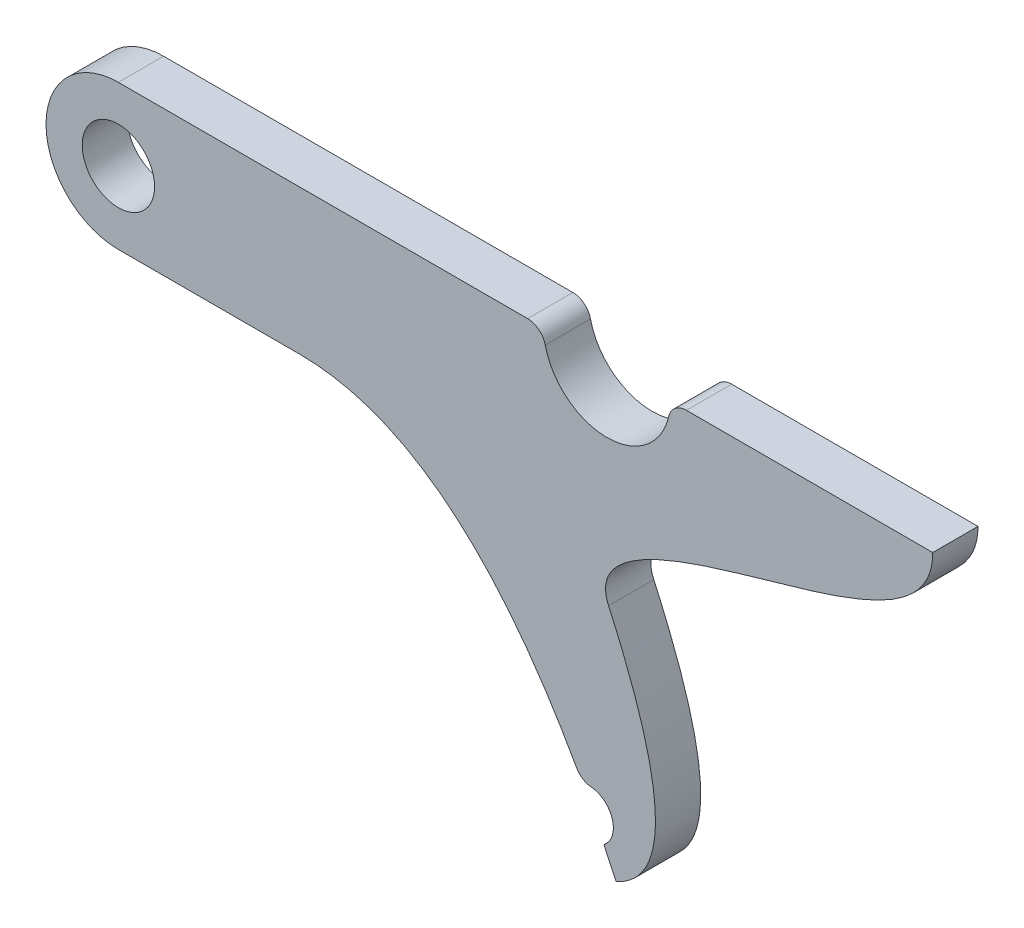
ISO-10303-21;
HEADER;
FILE_DESCRIPTION(('STEP AP214'),'2;1');
FILE_NAME('part.step','',(''),(''),'','','');
FILE_SCHEMA(('AUTOMOTIVE_DESIGN { 1 0 10303 214 1 1 1 1 }'));
ENDSEC;
DATA;
#1=APPLICATION_CONTEXT('core data for automotive mechanical design processes');
#2=APPLICATION_PROTOCOL_DEFINITION('international standard','automotive_design',2000,#1);
#3=PRODUCT_CONTEXT('',#1,'mechanical');
#4=PRODUCT('Part','Part','',(#3));
#5=PRODUCT_RELATED_PRODUCT_CATEGORY('part','',(#4));
#6=PRODUCT_DEFINITION_FORMATION('','',#4);
#7=PRODUCT_DEFINITION_CONTEXT('part definition',#1,'design');
#8=PRODUCT_DEFINITION('design','',#6,#7);
#9=PRODUCT_DEFINITION_SHAPE('','',#8);
#10=(LENGTH_UNIT() NAMED_UNIT(*) SI_UNIT(.MILLI.,.METRE.));
#11=(NAMED_UNIT(*) PLANE_ANGLE_UNIT() SI_UNIT($,.RADIAN.));
#12=(NAMED_UNIT(*) SI_UNIT($,.STERADIAN.) SOLID_ANGLE_UNIT());
#13=UNCERTAINTY_MEASURE_WITH_UNIT(LENGTH_MEASURE(1.E-05),#10,'distance_accuracy_value','');
#14=(GEOMETRIC_REPRESENTATION_CONTEXT(3) GLOBAL_UNCERTAINTY_ASSIGNED_CONTEXT((#13)) GLOBAL_UNIT_ASSIGNED_CONTEXT((#10,
#11,#12)) REPRESENTATION_CONTEXT('',''));
#15=CARTESIAN_POINT('',(0.,0.,0.));
#16=DIRECTION('',(0.,0.,1.));
#17=DIRECTION('',(1.,0.,0.));
#18=AXIS2_PLACEMENT_3D('',#15,#16,#17);
#19=CARTESIAN_POINT('',(0.,4.,2.5));
#20=DIRECTION('',(0.,1.,0.));
#21=DIRECTION('',(0.,0.,1.));
#22=AXIS2_PLACEMENT_3D('',#19,#20,#21);
#23=PLANE('',#22);
#24=DIRECTION('',(1.,0.,0.));
#25=VECTOR('',#24,1.);
#26=CARTESIAN_POINT('',(0.,4.,2.5));
#27=LINE('',#26,#25);
#28=CARTESIAN_POINT('',(0.,4.,2.5));
#29=VERTEX_POINT('',#28);
#30=CARTESIAN_POINT('',(22.6125178063039,4.,2.5));
#31=VERTEX_POINT('',#30);
#32=EDGE_CURVE('E130',#29,#31,#27,.T.);
#33=ORIENTED_EDGE('',*,*,#32,.T.);
#34=DIRECTION('',(0.,0.,-1.));
#35=VECTOR('',#34,1.);
#36=CARTESIAN_POINT('',(22.6125178063039,4.,0.));
#37=LINE('',#36,#35);
#38=CARTESIAN_POINT('',(22.6125178063039,4.,0.));
#39=VERTEX_POINT('',#38);
#40=EDGE_CURVE('E11',#31,#39,#37,.T.);
#41=ORIENTED_EDGE('',*,*,#40,.T.);
#42=DIRECTION('',(1.,0.,0.));
#43=VECTOR('',#42,1.);
#44=CARTESIAN_POINT('',(0.,4.,0.));
#45=LINE('',#44,#43);
#46=CARTESIAN_POINT('',(0.,4.,0.));
#47=VERTEX_POINT('',#46);
#48=EDGE_CURVE('E133',#47,#39,#45,.T.);
#49=ORIENTED_EDGE('',*,*,#48,.F.);
#50=DIRECTION('',(0.,0.,-1.));
#51=VECTOR('',#50,1.);
#52=CARTESIAN_POINT('',(0.,4.,2.5));
#53=LINE('',#52,#51);
#54=EDGE_CURVE('E128',#29,#47,#53,.T.);
#55=ORIENTED_EDGE('',*,*,#54,.F.);
#56=EDGE_LOOP('',(#33,#41,#49,#55));
#57=FACE_BOUND('',#56,.T.);
#58=ADVANCED_FACE('F34',(#57),#23,.T.);
#59=CARTESIAN_POINT('',(31.3874821936961,4.,0.));
#60=VERTEX_POINT('',#59);
#61=CARTESIAN_POINT('',(45.,4.,0.));
#62=VERTEX_POINT('',#61);
#63=EDGE_CURVE('E342',#60,#62,#45,.T.);
#64=ORIENTED_EDGE('',*,*,#63,.F.);
#65=DIRECTION('',(0.,0.,-1.));
#66=VECTOR('',#65,1.);
#67=CARTESIAN_POINT('',(31.3874821936961,4.,2.5));
#68=LINE('',#67,#66);
#69=CARTESIAN_POINT('',(31.3874821936961,4.,2.5));
#70=VERTEX_POINT('',#69);
#71=EDGE_CURVE('E42',#60,#70,#68,.F.);
#72=ORIENTED_EDGE('',*,*,#71,.T.);
#73=CARTESIAN_POINT('',(45.,4.,2.5));
#74=VERTEX_POINT('',#73);
#75=EDGE_CURVE('E148',#70,#74,#27,.T.);
#76=ORIENTED_EDGE('',*,*,#75,.T.);
#77=DIRECTION('',(0.,0.,-1.));
#78=VECTOR('',#77,1.);
#79=CARTESIAN_POINT('',(45.,4.,2.5));
#80=LINE('',#79,#78);
#81=EDGE_CURVE('E332',#74,#62,#80,.T.);
#82=ORIENTED_EDGE('',*,*,#81,.T.);
#83=EDGE_LOOP('',(#64,#72,#76,#82));
#84=FACE_BOUND('',#83,.T.);
#85=ADVANCED_FACE('F186',(#84),#23,.T.);
#86=CARTESIAN_POINT('',(0.,0.,2.5));
#87=DIRECTION('',(0.,0.,-1.));
#88=DIRECTION('',(-1.,0.,0.));
#89=AXIS2_PLACEMENT_3D('',#86,#87,#88);
#90=CYLINDRICAL_SURFACE('',#89,4.);
#91=CARTESIAN_POINT('',(0.,0.,0.));
#92=DIRECTION('',(0.,0.,1.));
#93=DIRECTION('',(1.,0.,0.));
#94=AXIS2_PLACEMENT_3D('',#91,#92,#93);
#95=CIRCLE('',#94,4.);
#96=CARTESIAN_POINT('',(0.,-4.,0.));
#97=VERTEX_POINT('',#96);
#98=EDGE_CURVE('E341',#47,#97,#95,.T.);
#99=ORIENTED_EDGE('',*,*,#98,.T.);
#100=DIRECTION('',(0.,0.,-1.));
#101=VECTOR('',#100,1.);
#102=CARTESIAN_POINT('',(0.,-4.,2.5));
#103=LINE('',#102,#101);
#104=CARTESIAN_POINT('',(0.,-4.,2.5));
#105=VERTEX_POINT('',#104);
#106=EDGE_CURVE('E137',#105,#97,#103,.T.);
#107=ORIENTED_EDGE('',*,*,#106,.F.);
#108=CARTESIAN_POINT('',(0.,0.,2.5));
#109=DIRECTION('',(0.,0.,1.));
#110=DIRECTION('',(1.,0.,0.));
#111=AXIS2_PLACEMENT_3D('',#108,#109,#110);
#112=CIRCLE('',#111,4.);
#113=EDGE_CURVE('E140',#29,#105,#112,.T.);
#114=ORIENTED_EDGE('',*,*,#113,.F.);
#115=ORIENTED_EDGE('',*,*,#54,.T.);
#116=EDGE_LOOP('',(#99,#107,#114,#115));
#117=FACE_BOUND('',#116,.T.);
#118=ADVANCED_FACE('F141',(#117),#90,.T.);
#119=CARTESIAN_POINT('',(0.,-4.,2.5));
#120=DIRECTION('',(0.,1.,0.));
#121=DIRECTION('',(0.,0.,1.));
#122=AXIS2_PLACEMENT_3D('',#119,#120,#121);
#123=PLANE('',#122);
#124=DIRECTION('',(1.,0.,0.));
#125=VECTOR('',#124,1.);
#126=CARTESIAN_POINT('',(0.,-4.,0.));
#127=LINE('',#126,#125);
#128=CARTESIAN_POINT('',(10.,-4.,0.));
#129=VERTEX_POINT('',#128);
#130=EDGE_CURVE('E344',#97,#129,#127,.T.);
#131=ORIENTED_EDGE('',*,*,#130,.T.);
#132=DIRECTION('',(0.,0.,-1.));
#133=VECTOR('',#132,1.);
#134=CARTESIAN_POINT('',(10.,-4.,2.5));
#135=LINE('',#134,#133);
#136=CARTESIAN_POINT('',(10.,-4.,2.5));
#137=VERTEX_POINT('',#136);
#138=EDGE_CURVE('E382',#137,#129,#135,.T.);
#139=ORIENTED_EDGE('',*,*,#138,.F.);
#140=DIRECTION('',(1.,0.,0.));
#141=VECTOR('',#140,1.);
#142=CARTESIAN_POINT('',(0.,-4.,2.5));
#143=LINE('',#142,#141);
#144=EDGE_CURVE('E144',#105,#137,#143,.T.);
#145=ORIENTED_EDGE('',*,*,#144,.F.);
#146=ORIENTED_EDGE('',*,*,#106,.T.);
#147=EDGE_LOOP('',(#131,#139,#145,#146));
#148=FACE_BOUND('',#147,.T.);
#149=ADVANCED_FACE('F180',(#148),#123,.F.);
#150=CARTESIAN_POINT('',(10.,-4.,2.5));
#151=CARTESIAN_POINT('',(20.,-4.,2.5));
#152=CARTESIAN_POINT('',(27.5,-20.5,2.5));
#153=B_SPLINE_CURVE_WITH_KNOTS('',2,(#150,#151,#152),.UNSPECIFIED.,.F.,.F.,(3,3),(0.,1.),.UNSPECIFIED.);
#154=DIRECTION('',(0.,0.,-1.));
#155=VECTOR('',#154,1.);
#156=SURFACE_OF_LINEAR_EXTRUSION('',#153,#155);
#157=CARTESIAN_POINT('',(10.,-4.,0.));
#158=CARTESIAN_POINT('',(20.,-4.,0.));
#159=CARTESIAN_POINT('',(27.5,-20.5,0.));
#160=B_SPLINE_CURVE_WITH_KNOTS('',2,(#157,#158,#159),.UNSPECIFIED.,.F.,.F.,(3,3),(0.,1.),.UNSPECIFIED.);
#161=CARTESIAN_POINT('',(25.3175861867431,-16.1430948860606,0.));
#162=VERTEX_POINT('',#161);
#163=EDGE_CURVE('E346',#129,#162,#160,.T.);
#164=ORIENTED_EDGE('',*,*,#163,.T.);
#165=DIRECTION('',(0.,0.,-1.));
#166=VECTOR('',#165,1.);
#167=CARTESIAN_POINT('',(25.3175861867427,-16.1430948860598,0.));
#168=LINE('',#167,#166);
#169=CARTESIAN_POINT('',(25.3175861867431,-16.1430948860606,2.5));
#170=VERTEX_POINT('',#169);
#171=EDGE_CURVE('E397',#162,#170,#168,.F.);
#172=ORIENTED_EDGE('',*,*,#171,.T.);
#173=EDGE_CURVE('E156',#137,#170,#153,.T.);
#174=ORIENTED_EDGE('',*,*,#173,.F.);
#175=ORIENTED_EDGE('',*,*,#138,.T.);
#176=EDGE_LOOP('',(#164,#172,#174,#175));
#177=FACE_BOUND('',#176,.T.);
#178=ADVANCED_FACE('F175',(#177),#156,.F.);
#179=CARTESIAN_POINT('',(26.,-18.,2.5));
#180=DIRECTION('',(0.,0.,-1.));
#181=DIRECTION('',(-1.,0.,0.));
#182=AXIS2_PLACEMENT_3D('',#179,#180,#181);
#183=CYLINDRICAL_SURFACE('',#182,1.35);
#184=CARTESIAN_POINT('',(26.,-18.,2.5));
#185=DIRECTION('',(0.,0.,1.));
#186=DIRECTION('',(1.,0.,0.));
#187=AXIS2_PLACEMENT_3D('',#184,#185,#186);
#188=CIRCLE('',#187,1.35);
#189=CARTESIAN_POINT('',(26.8284055247011,-19.0659476003278,2.5));
#190=VERTEX_POINT('',#189);
#191=CARTESIAN_POINT('',(26.1102786785099,-16.6545117566229,2.5));
#192=VERTEX_POINT('',#191);
#193=EDGE_CURVE('E161',#190,#192,#188,.T.);
#194=ORIENTED_EDGE('',*,*,#193,.T.);
#195=DIRECTION('',(0.,0.,-1.));
#196=VECTOR('',#195,1.);
#197=CARTESIAN_POINT('',(26.1102786785099,-16.6545117566229,2.5));
#198=LINE('',#197,#196);
#199=CARTESIAN_POINT('',(26.1102786785099,-16.6545117566229,0.));
#200=VERTEX_POINT('',#199);
#201=EDGE_CURVE('E388',#192,#200,#198,.T.);
#202=ORIENTED_EDGE('',*,*,#201,.T.);
#203=CARTESIAN_POINT('',(26.,-18.,0.));
#204=DIRECTION('',(0.,0.,1.));
#205=DIRECTION('',(1.,0.,0.));
#206=AXIS2_PLACEMENT_3D('',#203,#204,#205);
#207=CIRCLE('',#206,1.35);
#208=CARTESIAN_POINT('',(26.8284055247011,-19.0659476003278,0.));
#209=VERTEX_POINT('',#208);
#210=EDGE_CURVE('E351',#209,#200,#207,.T.);
#211=ORIENTED_EDGE('',*,*,#210,.F.);
#212=DIRECTION('',(0.,0.,-1.));
#213=VECTOR('',#212,1.);
#214=CARTESIAN_POINT('',(26.8284055247011,-19.0659476003278,2.5));
#215=LINE('',#214,#213);
#216=EDGE_CURVE('E380',#190,#209,#215,.T.);
#217=ORIENTED_EDGE('',*,*,#216,.F.);
#218=EDGE_LOOP('',(#194,#202,#211,#217));
#219=FACE_BOUND('',#218,.T.);
#220=ADVANCED_FACE('F173',(#219),#183,.F.);
#221=CARTESIAN_POINT('',(27.5,-20.5,0.));
#222=VERTEX_POINT('',#221);
#223=EDGE_CURVE('E352',#209,#222,#160,.T.);
#224=ORIENTED_EDGE('',*,*,#223,.T.);
#225=DIRECTION('',(0.,0.,-1.));
#226=VECTOR('',#225,1.);
#227=CARTESIAN_POINT('',(27.5,-20.5,2.5));
#228=LINE('',#227,#226);
#229=CARTESIAN_POINT('',(27.5,-20.5,2.5));
#230=VERTEX_POINT('',#229);
#231=EDGE_CURVE('E377',#230,#222,#228,.T.);
#232=ORIENTED_EDGE('',*,*,#231,.F.);
#233=EDGE_CURVE('E162',#190,#230,#153,.T.);
#234=ORIENTED_EDGE('',*,*,#233,.F.);
#235=ORIENTED_EDGE('',*,*,#216,.T.);
#236=EDGE_LOOP('',(#224,#232,#234,#235));
#237=FACE_BOUND('',#236,.T.);
#238=ADVANCED_FACE('F168',(#237),#156,.F.);
#239=CARTESIAN_POINT('',(27.5,-20.5,2.5));
#240=CARTESIAN_POINT('',(32.051832387313,-18.4309852784941,2.5));
#241=CARTESIAN_POINT('',(27.0861970556988,-7.50658754894282,2.5));
#242=B_SPLINE_CURVE_WITH_KNOTS('',2,(#239,#240,#241),.UNSPECIFIED.,.F.,.F.,(3,3),(0.,1.),.UNSPECIFIED.);
#243=DIRECTION('',(0.,0.,-1.));
#244=VECTOR('',#243,1.);
#245=SURFACE_OF_LINEAR_EXTRUSION('',#242,#244);
#246=CARTESIAN_POINT('',(27.5,-20.5,0.));
#247=CARTESIAN_POINT('',(32.051832387313,-18.4309852784941,0.));
#248=CARTESIAN_POINT('',(27.0861970556988,-7.50658754894282,0.));
#249=B_SPLINE_CURVE_WITH_KNOTS('',2,(#246,#247,#248),.UNSPECIFIED.,.F.,.F.,(3,3),(0.,1.),.UNSPECIFIED.);
#250=CARTESIAN_POINT('',(27.0861970556988,-7.50658754894282,0.));
#251=VERTEX_POINT('',#250);
#252=EDGE_CURVE('E358',#222,#251,#249,.T.);
#253=ORIENTED_EDGE('',*,*,#252,.T.);
#254=DIRECTION('',(0.,0.,-1.));
#255=VECTOR('',#254,1.);
#256=CARTESIAN_POINT('',(27.0861970556988,-7.50658754894282,2.5));
#257=LINE('',#256,#255);
#258=CARTESIAN_POINT('',(27.0861970556988,-7.50658754894282,2.5));
#259=VERTEX_POINT('',#258);
#260=EDGE_CURVE('E374',#259,#251,#257,.T.);
#261=ORIENTED_EDGE('',*,*,#260,.F.);
#262=EDGE_CURVE('E333',#230,#259,#242,.T.);
#263=ORIENTED_EDGE('',*,*,#262,.F.);
#264=ORIENTED_EDGE('',*,*,#231,.T.);
#265=EDGE_LOOP('',(#253,#261,#263,#264));
#266=FACE_BOUND('',#265,.T.);
#267=ADVANCED_FACE('F172',(#266),#245,.F.);
#268=CARTESIAN_POINT('',(27.0861970556988,-7.50658754894282,2.5));
#269=CARTESIAN_POINT('',(25.4922936243612,-4.,2.5));
#270=CARTESIAN_POINT('',(34.2809074109926,-1.5,2.5));
#271=CARTESIAN_POINT('',(45.,-1.5,2.5));
#272=CARTESIAN_POINT('',(45.,4.,2.5));
#273=B_SPLINE_CURVE_WITH_KNOTS('',4,(#268,#269,#270,#271,#272),.UNSPECIFIED.,.F.,.F.,(5,5),(0.,
1.),.UNSPECIFIED.);
#274=DIRECTION('',(0.,0.,-1.));
#275=VECTOR('',#274,1.);
#276=SURFACE_OF_LINEAR_EXTRUSION('',#273,#275);
#277=CARTESIAN_POINT('',(27.0861970556988,-7.50658754894282,0.));
#278=CARTESIAN_POINT('',(25.4922936243612,-4.,0.));
#279=CARTESIAN_POINT('',(34.2809074109926,-1.5,0.));
#280=CARTESIAN_POINT('',(45.,-1.5,0.));
#281=CARTESIAN_POINT('',(45.,4.,0.));
#282=B_SPLINE_CURVE_WITH_KNOTS('',4,(#277,#278,#279,#280,#281),.UNSPECIFIED.,.F.,.F.,(5,5),(0.,
1.),.UNSPECIFIED.);
#283=EDGE_CURVE('E150',#251,#62,#282,.T.);
#284=ORIENTED_EDGE('',*,*,#283,.T.);
#285=ORIENTED_EDGE('',*,*,#81,.F.);
#286=EDGE_CURVE('E326',#259,#74,#273,.T.);
#287=ORIENTED_EDGE('',*,*,#286,.F.);
#288=ORIENTED_EDGE('',*,*,#260,.T.);
#289=EDGE_LOOP('',(#284,#285,#287,#288));
#290=FACE_BOUND('',#289,.T.);
#291=ADVANCED_FACE('F238',(#290),#276,.F.);
#292=CARTESIAN_POINT('',(0.,0.,2.5));
#293=DIRECTION('',(0.,0.,1.));
#294=DIRECTION('',(1.,0.,0.));
#295=AXIS2_PLACEMENT_3D('',#292,#293,#294);
#296=PLANE('',#295);
#297=CARTESIAN_POINT('',(0.,0.,2.5));
#298=DIRECTION('',(0.,0.,1.));
#299=DIRECTION('',(1.,0.,0.));
#300=AXIS2_PLACEMENT_3D('',#297,#298,#299);
#301=CIRCLE('',#300,2.);
#302=CARTESIAN_POINT('',(2.,0.,2.5));
#303=VERTEX_POINT('',#302);
#304=EDGE_CURVE('E415',#303,#303,#301,.T.);
#305=ORIENTED_EDGE('',*,*,#304,.F.);
#306=EDGE_LOOP('',(#305));
#307=FACE_BOUND('',#306,.T.);
#308=ORIENTED_EDGE('',*,*,#173,.T.);
#309=CARTESIAN_POINT('',(26.1919665885173,-15.6578537985657,2.5));
#310=DIRECTION('',(0.,0.,1.));
#311=DIRECTION('',(1.,0.,0.));
#312=AXIS2_PLACEMENT_3D('',#309,#310,#311);
#313=CIRCLE('',#312,1.);
#314=EDGE_CURVE('E402',#170,#192,#313,.T.);
#315=ORIENTED_EDGE('',*,*,#314,.T.);
#316=ORIENTED_EDGE('',*,*,#193,.F.);
#317=ORIENTED_EDGE('',*,*,#233,.T.);
#318=ORIENTED_EDGE('',*,*,#262,.T.);
#319=ORIENTED_EDGE('',*,*,#286,.T.);
#320=ORIENTED_EDGE('',*,*,#75,.F.);
#321=CARTESIAN_POINT('',(31.3874821936961,3.,2.5));
#322=DIRECTION('',(0.,0.,1.));
#323=DIRECTION('',(1.,0.,0.));
#324=AXIS2_PLACEMENT_3D('',#321,#322,#323);
#325=CIRCLE('',#324,1.);
#326=CARTESIAN_POINT('',(30.4124861506525,3.22222222222222,2.5));
#327=VERTEX_POINT('',#326);
#328=EDGE_CURVE('E400',#70,#327,#325,.T.);
#329=ORIENTED_EDGE('',*,*,#328,.T.);
#330=CARTESIAN_POINT('',(27.,4.,2.5));
#331=DIRECTION('',(0.,0.,1.));
#332=DIRECTION('',(1.,0.,0.));
#333=AXIS2_PLACEMENT_3D('',#330,#331,#332);
#334=CIRCLE('',#333,3.5);
#335=CARTESIAN_POINT('',(23.5875138493475,3.22222222222222,2.5));
#336=VERTEX_POINT('',#335);
#337=EDGE_CURVE('E152',#336,#327,#334,.T.);
#338=ORIENTED_EDGE('',*,*,#337,.F.);
#339=CARTESIAN_POINT('',(22.6125178063039,3.,2.5));
#340=DIRECTION('',(0.,0.,1.));
#341=DIRECTION('',(1.,0.,0.));
#342=AXIS2_PLACEMENT_3D('',#339,#340,#341);
#343=CIRCLE('',#342,1.);
#344=EDGE_CURVE('E56',#336,#31,#343,.T.);
#345=ORIENTED_EDGE('',*,*,#344,.T.);
#346=ORIENTED_EDGE('',*,*,#32,.F.);
#347=ORIENTED_EDGE('',*,*,#113,.T.);
#348=ORIENTED_EDGE('',*,*,#144,.T.);
#349=EDGE_LOOP('',(#308,#315,#316,#317,#318,#319,#320,#329,#338,#345,#346,#347,#348));
#350=FACE_BOUND('',#349,.T.);
#351=ADVANCED_FACE('F147',(#307,#350),#296,.T.);
#352=CARTESIAN_POINT('',(0.,0.,0.));
#353=DIRECTION('',(0.,0.,1.));
#354=DIRECTION('',(1.,0.,0.));
#355=AXIS2_PLACEMENT_3D('',#352,#353,#354);
#356=PLANE('',#355);
#357=CARTESIAN_POINT('',(0.,0.,0.));
#358=DIRECTION('',(0.,0.,1.));
#359=DIRECTION('',(1.,0.,0.));
#360=AXIS2_PLACEMENT_3D('',#357,#358,#359);
#361=CIRCLE('',#360,2.);
#362=CARTESIAN_POINT('',(2.,0.,0.));
#363=VERTEX_POINT('',#362);
#364=EDGE_CURVE('E417',#363,#363,#361,.T.);
#365=ORIENTED_EDGE('',*,*,#364,.T.);
#366=EDGE_LOOP('',(#365));
#367=FACE_BOUND('',#366,.T.);
#368=ORIENTED_EDGE('',*,*,#210,.T.);
#369=CARTESIAN_POINT('',(26.1919665885173,-15.6578537985657,0.));
#370=DIRECTION('',(0.,0.,1.));
#371=DIRECTION('',(1.,0.,0.));
#372=AXIS2_PLACEMENT_3D('',#369,#370,#371);
#373=CIRCLE('',#372,1.);
#374=EDGE_CURVE('E395',#200,#162,#373,.F.);
#375=ORIENTED_EDGE('',*,*,#374,.T.);
#376=ORIENTED_EDGE('',*,*,#163,.F.);
#377=ORIENTED_EDGE('',*,*,#130,.F.);
#378=ORIENTED_EDGE('',*,*,#98,.F.);
#379=ORIENTED_EDGE('',*,*,#48,.T.);
#380=CARTESIAN_POINT('',(22.6125178063039,3.,0.));
#381=DIRECTION('',(0.,0.,1.));
#382=DIRECTION('',(1.,0.,0.));
#383=AXIS2_PLACEMENT_3D('',#380,#381,#382);
#384=CIRCLE('',#383,1.);
#385=CARTESIAN_POINT('',(23.5875138493475,3.22222222222222,0.));
#386=VERTEX_POINT('',#385);
#387=EDGE_CURVE('E391',#39,#386,#384,.F.);
#388=ORIENTED_EDGE('',*,*,#387,.T.);
#389=CARTESIAN_POINT('',(27.,4.,0.));
#390=DIRECTION('',(0.,0.,1.));
#391=DIRECTION('',(1.,0.,0.));
#392=AXIS2_PLACEMENT_3D('',#389,#390,#391);
#393=CIRCLE('',#392,3.5);
#394=CARTESIAN_POINT('',(30.4124861506525,3.22222222222222,0.));
#395=VERTEX_POINT('',#394);
#396=EDGE_CURVE('E136',#386,#395,#393,.T.);
#397=ORIENTED_EDGE('',*,*,#396,.T.);
#398=CARTESIAN_POINT('',(31.3874821936961,3.,0.));
#399=DIRECTION('',(0.,0.,1.));
#400=DIRECTION('',(1.,0.,0.));
#401=AXIS2_PLACEMENT_3D('',#398,#399,#400);
#402=CIRCLE('',#401,1.);
#403=EDGE_CURVE('E393',#395,#60,#402,.F.);
#404=ORIENTED_EDGE('',*,*,#403,.T.);
#405=ORIENTED_EDGE('',*,*,#63,.T.);
#406=ORIENTED_EDGE('',*,*,#283,.F.);
#407=ORIENTED_EDGE('',*,*,#252,.F.);
#408=ORIENTED_EDGE('',*,*,#223,.F.);
#409=EDGE_LOOP('',(#368,#375,#376,#377,#378,#379,#388,#397,#404,#405,#406,#407,#408));
#410=FACE_BOUND('',#409,.T.);
#411=ADVANCED_FACE('F250',(#367,#410),#356,.F.);
#412=CARTESIAN_POINT('',(27.,4.,0.));
#413=DIRECTION('',(0.,0.,1.));
#414=DIRECTION('',(1.,0.,0.));
#415=AXIS2_PLACEMENT_3D('',#412,#413,#414);
#416=CYLINDRICAL_SURFACE('',#415,3.5);
#417=ORIENTED_EDGE('',*,*,#337,.T.);
#418=DIRECTION('',(0.,0.,1.));
#419=VECTOR('',#418,1.);
#420=CARTESIAN_POINT('',(30.4124861506525,3.22222222222222,0.));
#421=LINE('',#420,#419);
#422=EDGE_CURVE('E407',#327,#395,#421,.F.);
#423=ORIENTED_EDGE('',*,*,#422,.T.);
#424=ORIENTED_EDGE('',*,*,#396,.F.);
#425=DIRECTION('',(0.,0.,1.));
#426=VECTOR('',#425,1.);
#427=CARTESIAN_POINT('',(23.5875138493475,3.22222222222222,0.));
#428=LINE('',#427,#426);
#429=EDGE_CURVE('E404',#386,#336,#428,.T.);
#430=ORIENTED_EDGE('',*,*,#429,.T.);
#431=EDGE_LOOP('',(#417,#423,#424,#430));
#432=FACE_BOUND('',#431,.T.);
#433=ADVANCED_FACE('F258',(#432),#416,.F.);
#434=CARTESIAN_POINT('',(0.,0.,0.));
#435=DIRECTION('',(0.,0.,1.));
#436=DIRECTION('',(1.,0.,0.));
#437=AXIS2_PLACEMENT_3D('',#434,#435,#436);
#438=CYLINDRICAL_SURFACE('',#437,2.);
#439=ORIENTED_EDGE('',*,*,#364,.F.);
#440=EDGE_LOOP('',(#439));
#441=FACE_BOUND('',#440,.T.);
#442=ORIENTED_EDGE('',*,*,#304,.T.);
#443=EDGE_LOOP('',(#442));
#444=FACE_BOUND('',#443,.T.);
#445=ADVANCED_FACE('F192',(#441,#444),#438,.F.);
#446=CARTESIAN_POINT('',(26.1919665885173,-15.6578537985657,1.25));
#447=DIRECTION('',(0.,0.,-1.));
#448=DIRECTION('',(-1.,0.,0.));
#449=AXIS2_PLACEMENT_3D('',#446,#447,#448);
#450=CYLINDRICAL_SURFACE('',#449,1.);
#451=ORIENTED_EDGE('',*,*,#314,.F.);
#452=ORIENTED_EDGE('',*,*,#171,.F.);
#453=ORIENTED_EDGE('',*,*,#374,.F.);
#454=ORIENTED_EDGE('',*,*,#201,.F.);
#455=EDGE_LOOP('',(#451,#452,#453,#454));
#456=FACE_BOUND('',#455,.T.);
#457=ADVANCED_FACE('F189',(#456),#450,.T.);
#458=CARTESIAN_POINT('',(31.3874821936961,3.,0.));
#459=DIRECTION('',(0.,0.,1.));
#460=DIRECTION('',(1.,0.,0.));
#461=AXIS2_PLACEMENT_3D('',#458,#459,#460);
#462=CYLINDRICAL_SURFACE('',#461,1.);
#463=ORIENTED_EDGE('',*,*,#328,.F.);
#464=ORIENTED_EDGE('',*,*,#71,.F.);
#465=ORIENTED_EDGE('',*,*,#403,.F.);
#466=ORIENTED_EDGE('',*,*,#422,.F.);
#467=EDGE_LOOP('',(#463,#464,#465,#466));
#468=FACE_BOUND('',#467,.T.);
#469=ADVANCED_FACE('F191',(#468),#462,.T.);
#470=CARTESIAN_POINT('',(22.6125178063039,3.,0.));
#471=DIRECTION('',(0.,0.,1.));
#472=DIRECTION('',(1.,0.,0.));
#473=AXIS2_PLACEMENT_3D('',#470,#471,#472);
#474=CYLINDRICAL_SURFACE('',#473,1.);
#475=ORIENTED_EDGE('',*,*,#387,.F.);
#476=ORIENTED_EDGE('',*,*,#40,.F.);
#477=ORIENTED_EDGE('',*,*,#344,.F.);
#478=ORIENTED_EDGE('',*,*,#429,.F.);
#479=EDGE_LOOP('',(#475,#476,#477,#478));
#480=FACE_BOUND('',#479,.T.);
#481=ADVANCED_FACE('F36',(#480),#474,.T.);
#482=CLOSED_SHELL('',(#58,#85,#118,#149,#178,#220,#238,#267,#291,#351,#411,#433,#445,#457,#469,#481));
#483=MANIFOLD_SOLID_BREP('B2',#482);
#484=ADVANCED_BREP_SHAPE_REPRESENTATION('',(#18,#483),#14);
#485=SHAPE_DEFINITION_REPRESENTATION(#9,#484);
ENDSEC;
END-ISO-10303-21;
